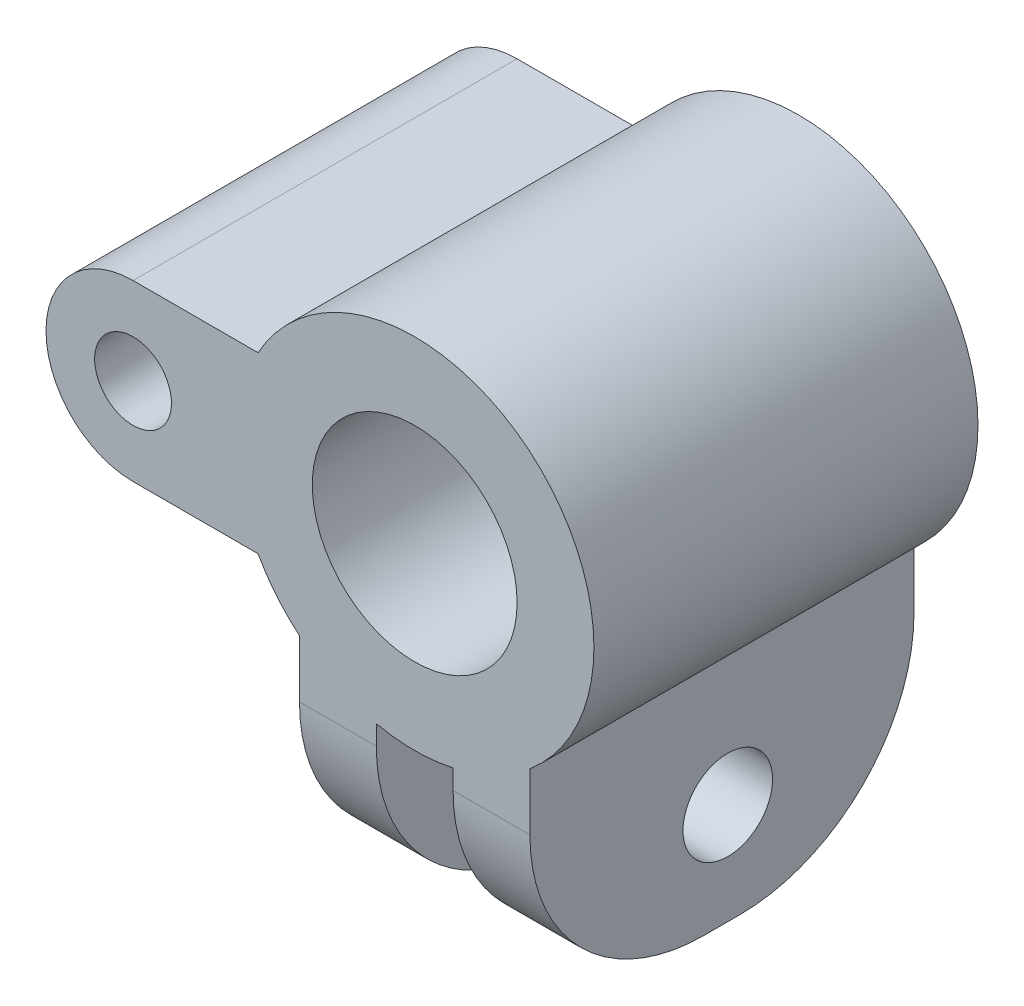
ISO-10303-21;
HEADER;
FILE_DESCRIPTION(('STEP AP214'),'2;1');
FILE_NAME('part.step','',(''),(''),'','','');
FILE_SCHEMA(('AUTOMOTIVE_DESIGN { 1 0 10303 214 1 1 1 1 }'));
ENDSEC;
DATA;
#1=APPLICATION_CONTEXT('core data for automotive mechanical design processes');
#2=APPLICATION_PROTOCOL_DEFINITION('international standard','automotive_design',2000,#1);
#3=PRODUCT_CONTEXT('',#1,'mechanical');
#4=PRODUCT('Part','Part','',(#3));
#5=PRODUCT_RELATED_PRODUCT_CATEGORY('part','',(#4));
#6=PRODUCT_DEFINITION_FORMATION('','',#4);
#7=PRODUCT_DEFINITION_CONTEXT('part definition',#1,'design');
#8=PRODUCT_DEFINITION('design','',#6,#7);
#9=PRODUCT_DEFINITION_SHAPE('','',#8);
#10=(LENGTH_UNIT() NAMED_UNIT(*) SI_UNIT(.MILLI.,.METRE.));
#11=(NAMED_UNIT(*) PLANE_ANGLE_UNIT() SI_UNIT($,.RADIAN.));
#12=(NAMED_UNIT(*) SI_UNIT($,.STERADIAN.) SOLID_ANGLE_UNIT());
#13=UNCERTAINTY_MEASURE_WITH_UNIT(LENGTH_MEASURE(1.E-05),#10,'distance_accuracy_value','');
#14=(GEOMETRIC_REPRESENTATION_CONTEXT(3) GLOBAL_UNCERTAINTY_ASSIGNED_CONTEXT((#13)) GLOBAL_UNIT_ASSIGNED_CONTEXT((#10,
#11,#12)) REPRESENTATION_CONTEXT('',''));
#15=CARTESIAN_POINT('',(0.,0.,0.));
#16=DIRECTION('',(0.,0.,1.));
#17=DIRECTION('',(1.,0.,0.));
#18=AXIS2_PLACEMENT_3D('',#15,#16,#17);
#19=CARTESIAN_POINT('',(0.,0.,75.));
#20=DIRECTION('',(0.,0.,-1.));
#21=DIRECTION('',(-1.,0.,0.));
#22=AXIS2_PLACEMENT_3D('',#19,#20,#21);
#23=CYLINDRICAL_SURFACE('',#22,35.);
#24=DIRECTION('',(0.,0.,-1.));
#25=VECTOR('',#24,1.);
#26=CARTESIAN_POINT('',(-22.5,-26.809513236909,75.));
#27=LINE('',#26,#25);
#28=CARTESIAN_POINT('',(-22.5,-26.809513236909,75.));
#29=VERTEX_POINT('',#28);
#30=CARTESIAN_POINT('',(-22.5,-26.809513236909,0.));
#31=VERTEX_POINT('',#30);
#32=EDGE_CURVE('E189',#29,#31,#27,.T.);
#33=ORIENTED_EDGE('',*,*,#32,.F.);
#34=CARTESIAN_POINT('',(0.,0.,75.));
#35=DIRECTION('',(0.,0.,1.));
#36=DIRECTION('',(1.,0.,0.));
#37=AXIS2_PLACEMENT_3D('',#34,#35,#36);
#38=CIRCLE('',#37,35.);
#39=CARTESIAN_POINT('',(-30.5941170815567,-17.,75.));
#40=VERTEX_POINT('',#39);
#41=EDGE_CURVE('E214',#40,#29,#38,.T.);
#42=ORIENTED_EDGE('',*,*,#41,.F.);
#43=DIRECTION('',(0.,0.,-1.));
#44=VECTOR('',#43,1.);
#45=CARTESIAN_POINT('',(-30.5941170815567,-17.,75.));
#46=LINE('',#45,#44);
#47=CARTESIAN_POINT('',(-30.5941170815567,-17.,0.));
#48=VERTEX_POINT('',#47);
#49=EDGE_CURVE('E227',#40,#48,#46,.T.);
#50=ORIENTED_EDGE('',*,*,#49,.T.);
#51=CARTESIAN_POINT('',(0.,0.,0.));
#52=DIRECTION('',(0.,0.,1.));
#53=DIRECTION('',(1.,0.,0.));
#54=AXIS2_PLACEMENT_3D('',#51,#52,#53);
#55=CIRCLE('',#54,35.);
#56=EDGE_CURVE('E172',#48,#31,#55,.T.);
#57=ORIENTED_EDGE('',*,*,#56,.T.);
#58=EDGE_LOOP('',(#33,#42,#50,#57));
#59=FACE_BOUND('',#58,.T.);
#60=ADVANCED_FACE('F33',(#59),#23,.T.);
#61=DIRECTION('',(0.,0.,-1.));
#62=VECTOR('',#61,1.);
#63=CARTESIAN_POINT('',(-7.49999999999999,-34.1869858279434,75.));
#64=LINE('',#63,#62);
#65=CARTESIAN_POINT('',(-7.49999999999999,-34.1869858279434,75.));
#66=VERTEX_POINT('',#65);
#67=CARTESIAN_POINT('',(-7.49999999999999,-34.1869858279434,0.));
#68=VERTEX_POINT('',#67);
#69=EDGE_CURVE('E154',#66,#68,#64,.T.);
#70=ORIENTED_EDGE('',*,*,#69,.T.);
#71=CARTESIAN_POINT('',(7.50000000000001,-34.1869858279434,0.));
#72=VERTEX_POINT('',#71);
#73=EDGE_CURVE('E162',#68,#72,#55,.T.);
#74=ORIENTED_EDGE('',*,*,#73,.T.);
#75=DIRECTION('',(0.,0.,-1.));
#76=VECTOR('',#75,1.);
#77=CARTESIAN_POINT('',(7.50000000000001,-34.1869858279434,75.));
#78=LINE('',#77,#76);
#79=CARTESIAN_POINT('',(7.50000000000001,-34.1869858279434,75.));
#80=VERTEX_POINT('',#79);
#81=EDGE_CURVE('E206',#80,#72,#78,.T.);
#82=ORIENTED_EDGE('',*,*,#81,.F.);
#83=EDGE_CURVE('E178',#66,#80,#38,.T.);
#84=ORIENTED_EDGE('',*,*,#83,.F.);
#85=EDGE_LOOP('',(#70,#74,#82,#84));
#86=FACE_BOUND('',#85,.T.);
#87=ADVANCED_FACE('F176',(#86),#23,.T.);
#88=CARTESIAN_POINT('',(22.5,-26.809513236909,75.));
#89=VERTEX_POINT('',#88);
#90=CARTESIAN_POINT('',(-30.5941170815567,17.,75.));
#91=VERTEX_POINT('',#90);
#92=EDGE_CURVE('E212',#89,#91,#38,.T.);
#93=ORIENTED_EDGE('',*,*,#92,.F.);
#94=DIRECTION('',(0.,0.,-1.));
#95=VECTOR('',#94,1.);
#96=CARTESIAN_POINT('',(22.5,-26.809513236909,75.));
#97=LINE('',#96,#95);
#98=CARTESIAN_POINT('',(22.5,-26.809513236909,0.));
#99=VERTEX_POINT('',#98);
#100=EDGE_CURVE('E197',#89,#99,#97,.T.);
#101=ORIENTED_EDGE('',*,*,#100,.T.);
#102=CARTESIAN_POINT('',(-30.5941170815567,17.,0.));
#103=VERTEX_POINT('',#102);
#104=EDGE_CURVE('E173',#99,#103,#55,.T.);
#105=ORIENTED_EDGE('',*,*,#104,.T.);
#106=DIRECTION('',(0.,0.,-1.));
#107=VECTOR('',#106,1.);
#108=CARTESIAN_POINT('',(-30.5941170815567,17.,75.));
#109=LINE('',#108,#107);
#110=EDGE_CURVE('E246',#91,#103,#109,.T.);
#111=ORIENTED_EDGE('',*,*,#110,.F.);
#112=EDGE_LOOP('',(#93,#101,#105,#111));
#113=FACE_BOUND('',#112,.T.);
#114=ADVANCED_FACE('F297',(#113),#23,.T.);
#115=CARTESIAN_POINT('',(0.,17.,75.));
#116=DIRECTION('',(0.,1.,0.));
#117=DIRECTION('',(0.,0.,1.));
#118=AXIS2_PLACEMENT_3D('',#115,#116,#117);
#119=PLANE('',#118);
#120=DIRECTION('',(1.,0.,0.));
#121=VECTOR('',#120,1.);
#122=CARTESIAN_POINT('',(0.,17.,0.));
#123=LINE('',#122,#121);
#124=CARTESIAN_POINT('',(-55.,17.,0.));
#125=VERTEX_POINT('',#124);
#126=EDGE_CURVE('E230',#125,#103,#123,.T.);
#127=ORIENTED_EDGE('',*,*,#126,.F.);
#128=DIRECTION('',(0.,0.,-1.));
#129=VECTOR('',#128,1.);
#130=CARTESIAN_POINT('',(-55.,17.,75.));
#131=LINE('',#130,#129);
#132=CARTESIAN_POINT('',(-55.,17.,75.));
#133=VERTEX_POINT('',#132);
#134=EDGE_CURVE('E244',#133,#125,#131,.T.);
#135=ORIENTED_EDGE('',*,*,#134,.F.);
#136=DIRECTION('',(1.,0.,0.));
#137=VECTOR('',#136,1.);
#138=CARTESIAN_POINT('',(0.,17.,75.));
#139=LINE('',#138,#137);
#140=EDGE_CURVE('E217',#133,#91,#139,.T.);
#141=ORIENTED_EDGE('',*,*,#140,.T.);
#142=ORIENTED_EDGE('',*,*,#110,.T.);
#143=EDGE_LOOP('',(#127,#135,#141,#142));
#144=FACE_BOUND('',#143,.T.);
#145=ADVANCED_FACE('F300',(#144),#119,.T.);
#146=CARTESIAN_POINT('',(-55.,0.,75.));
#147=DIRECTION('',(0.,0.,-1.));
#148=DIRECTION('',(-1.,0.,0.));
#149=AXIS2_PLACEMENT_3D('',#146,#147,#148);
#150=CYLINDRICAL_SURFACE('',#149,17.);
#151=CARTESIAN_POINT('',(-55.,0.,0.));
#152=DIRECTION('',(0.,0.,1.));
#153=DIRECTION('',(1.,0.,0.));
#154=AXIS2_PLACEMENT_3D('',#151,#152,#153);
#155=CIRCLE('',#154,17.);
#156=CARTESIAN_POINT('',(-55.,-17.,0.));
#157=VERTEX_POINT('',#156);
#158=EDGE_CURVE('E233',#125,#157,#155,.T.);
#159=ORIENTED_EDGE('',*,*,#158,.T.);
#160=DIRECTION('',(0.,0.,-1.));
#161=VECTOR('',#160,1.);
#162=CARTESIAN_POINT('',(-55.,-17.,75.));
#163=LINE('',#162,#161);
#164=CARTESIAN_POINT('',(-55.,-17.,75.));
#165=VERTEX_POINT('',#164);
#166=EDGE_CURVE('E241',#165,#157,#163,.T.);
#167=ORIENTED_EDGE('',*,*,#166,.F.);
#168=CARTESIAN_POINT('',(-55.,0.,75.));
#169=DIRECTION('',(0.,0.,1.));
#170=DIRECTION('',(1.,0.,0.));
#171=AXIS2_PLACEMENT_3D('',#168,#169,#170);
#172=CIRCLE('',#171,17.);
#173=EDGE_CURVE('E220',#133,#165,#172,.T.);
#174=ORIENTED_EDGE('',*,*,#173,.F.);
#175=ORIENTED_EDGE('',*,*,#134,.T.);
#176=EDGE_LOOP('',(#159,#167,#174,#175));
#177=FACE_BOUND('',#176,.T.);
#178=ADVANCED_FACE('F305',(#177),#150,.T.);
#179=CARTESIAN_POINT('',(0.,-17.,75.));
#180=DIRECTION('',(0.,1.,0.));
#181=DIRECTION('',(0.,0.,1.));
#182=AXIS2_PLACEMENT_3D('',#179,#180,#181);
#183=PLANE('',#182);
#184=DIRECTION('',(1.,0.,0.));
#185=VECTOR('',#184,1.);
#186=CARTESIAN_POINT('',(0.,-17.,0.));
#187=LINE('',#186,#185);
#188=EDGE_CURVE('E235',#157,#48,#187,.T.);
#189=ORIENTED_EDGE('',*,*,#188,.T.);
#190=ORIENTED_EDGE('',*,*,#49,.F.);
#191=DIRECTION('',(1.,0.,0.));
#192=VECTOR('',#191,1.);
#193=CARTESIAN_POINT('',(0.,-17.,75.));
#194=LINE('',#193,#192);
#195=EDGE_CURVE('E222',#165,#40,#194,.T.);
#196=ORIENTED_EDGE('',*,*,#195,.F.);
#197=ORIENTED_EDGE('',*,*,#166,.T.);
#198=EDGE_LOOP('',(#189,#190,#196,#197));
#199=FACE_BOUND('',#198,.T.);
#200=ADVANCED_FACE('F312',(#199),#183,.F.);
#201=CARTESIAN_POINT('',(-55.,0.,75.));
#202=DIRECTION('',(0.,0.,-1.));
#203=DIRECTION('',(-1.,0.,0.));
#204=AXIS2_PLACEMENT_3D('',#201,#202,#203);
#205=CYLINDRICAL_SURFACE('',#204,7.5);
#206=CARTESIAN_POINT('',(-55.,0.,75.));
#207=DIRECTION('',(0.,0.,1.));
#208=DIRECTION('',(1.,0.,0.));
#209=AXIS2_PLACEMENT_3D('',#206,#207,#208);
#210=CIRCLE('',#209,7.5);
#211=CARTESIAN_POINT('',(-47.5,0.,75.));
#212=VERTEX_POINT('',#211);
#213=EDGE_CURVE('E209',#212,#212,#210,.T.);
#214=ORIENTED_EDGE('',*,*,#213,.T.);
#215=EDGE_LOOP('',(#214));
#216=FACE_BOUND('',#215,.T.);
#217=CARTESIAN_POINT('',(-55.,0.,0.));
#218=DIRECTION('',(0.,0.,1.));
#219=DIRECTION('',(1.,0.,0.));
#220=AXIS2_PLACEMENT_3D('',#217,#218,#219);
#221=CIRCLE('',#220,7.5);
#222=CARTESIAN_POINT('',(-47.5,0.,0.));
#223=VERTEX_POINT('',#222);
#224=EDGE_CURVE('E208',#223,#223,#221,.T.);
#225=ORIENTED_EDGE('',*,*,#224,.F.);
#226=EDGE_LOOP('',(#225));
#227=FACE_BOUND('',#226,.T.);
#228=ADVANCED_FACE('F371',(#216,#227),#205,.F.);
#229=CARTESIAN_POINT('',(0.,0.,75.));
#230=DIRECTION('',(0.,0.,-1.));
#231=DIRECTION('',(-1.,0.,0.));
#232=AXIS2_PLACEMENT_3D('',#229,#230,#231);
#233=CYLINDRICAL_SURFACE('',#232,20.);
#234=CARTESIAN_POINT('',(0.,0.,75.));
#235=DIRECTION('',(0.,0.,1.));
#236=DIRECTION('',(1.,0.,0.));
#237=AXIS2_PLACEMENT_3D('',#234,#235,#236);
#238=CIRCLE('',#237,20.);
#239=CARTESIAN_POINT('',(20.,0.,75.));
#240=VERTEX_POINT('',#239);
#241=EDGE_CURVE('E224',#240,#240,#238,.T.);
#242=ORIENTED_EDGE('',*,*,#241,.T.);
#243=EDGE_LOOP('',(#242));
#244=FACE_BOUND('',#243,.T.);
#245=CARTESIAN_POINT('',(0.,0.,0.));
#246=DIRECTION('',(0.,0.,1.));
#247=DIRECTION('',(1.,0.,0.));
#248=AXIS2_PLACEMENT_3D('',#245,#246,#247);
#249=CIRCLE('',#248,20.);
#250=CARTESIAN_POINT('',(20.,0.,0.));
#251=VERTEX_POINT('',#250);
#252=EDGE_CURVE('E213',#251,#251,#249,.T.);
#253=ORIENTED_EDGE('',*,*,#252,.F.);
#254=EDGE_LOOP('',(#253));
#255=FACE_BOUND('',#254,.T.);
#256=ADVANCED_FACE('F372',(#244,#255),#233,.F.);
#257=CARTESIAN_POINT('',(0.,0.,75.));
#258=DIRECTION('',(0.,0.,1.));
#259=DIRECTION('',(1.,0.,0.));
#260=AXIS2_PLACEMENT_3D('',#257,#258,#259);
#261=PLANE('',#260);
#262=ORIENTED_EDGE('',*,*,#213,.F.);
#263=EDGE_LOOP('',(#262));
#264=FACE_BOUND('',#263,.T.);
#265=DIRECTION('',(0.,1.,0.));
#266=VECTOR('',#265,1.);
#267=CARTESIAN_POINT('',(7.50000000000001,0.,75.));
#268=LINE('',#267,#266);
#269=CARTESIAN_POINT('',(7.50000000000001,-38.,75.));
#270=VERTEX_POINT('',#269);
#271=EDGE_CURVE('E192',#270,#80,#268,.T.);
#272=ORIENTED_EDGE('',*,*,#271,.F.);
#273=DIRECTION('',(-1.,0.,0.));
#274=VECTOR('',#273,1.);
#275=CARTESIAN_POINT('',(0.,-38.,75.));
#276=LINE('',#275,#274);
#277=CARTESIAN_POINT('',(22.5,-38.,75.));
#278=VERTEX_POINT('',#277);
#279=EDGE_CURVE('E11',#270,#278,#276,.F.);
#280=ORIENTED_EDGE('',*,*,#279,.T.);
#281=DIRECTION('',(0.,-1.,0.));
#282=VECTOR('',#281,1.);
#283=CARTESIAN_POINT('',(22.5,0.,75.));
#284=LINE('',#283,#282);
#285=EDGE_CURVE('E194',#89,#278,#284,.T.);
#286=ORIENTED_EDGE('',*,*,#285,.F.);
#287=ORIENTED_EDGE('',*,*,#92,.T.);
#288=ORIENTED_EDGE('',*,*,#140,.F.);
#289=ORIENTED_EDGE('',*,*,#173,.T.);
#290=ORIENTED_EDGE('',*,*,#195,.T.);
#291=ORIENTED_EDGE('',*,*,#41,.T.);
#292=DIRECTION('',(0.,-1.,0.));
#293=VECTOR('',#292,1.);
#294=CARTESIAN_POINT('',(-22.5,0.,75.));
#295=LINE('',#294,#293);
#296=CARTESIAN_POINT('',(-22.5,-38.,75.));
#297=VERTEX_POINT('',#296);
#298=EDGE_CURVE('E158',#29,#297,#295,.T.);
#299=ORIENTED_EDGE('',*,*,#298,.T.);
#300=DIRECTION('',(1.,0.,0.));
#301=VECTOR('',#300,1.);
#302=CARTESIAN_POINT('',(-7.50000000000002,-38.,75.));
#303=LINE('',#302,#301);
#304=CARTESIAN_POINT('',(-7.49999999999999,-38.,75.));
#305=VERTEX_POINT('',#304);
#306=EDGE_CURVE('E263',#297,#305,#303,.T.);
#307=ORIENTED_EDGE('',*,*,#306,.T.);
#308=DIRECTION('',(0.,1.,0.));
#309=VECTOR('',#308,1.);
#310=CARTESIAN_POINT('',(-7.49999999999999,0.,75.));
#311=LINE('',#310,#309);
#312=EDGE_CURVE('E180',#305,#66,#311,.T.);
#313=ORIENTED_EDGE('',*,*,#312,.T.);
#314=ORIENTED_EDGE('',*,*,#83,.T.);
#315=EDGE_LOOP('',(#272,#280,#286,#287,#288,#289,#290,#291,#299,#307,#313,#314));
#316=FACE_BOUND('',#315,.T.);
#317=ORIENTED_EDGE('',*,*,#241,.F.);
#318=EDGE_LOOP('',(#317));
#319=FACE_BOUND('',#318,.T.);
#320=ADVANCED_FACE('F292',(#264,#316,#319),#261,.T.);
#321=CARTESIAN_POINT('',(0.,0.,0.));
#322=DIRECTION('',(0.,0.,1.));
#323=DIRECTION('',(1.,0.,0.));
#324=AXIS2_PLACEMENT_3D('',#321,#322,#323);
#325=PLANE('',#324);
#326=ORIENTED_EDGE('',*,*,#224,.T.);
#327=EDGE_LOOP('',(#326));
#328=FACE_BOUND('',#327,.T.);
#329=DIRECTION('',(0.,-1.,0.));
#330=VECTOR('',#329,1.);
#331=CARTESIAN_POINT('',(22.5,0.,0.));
#332=LINE('',#331,#330);
#333=CARTESIAN_POINT('',(22.5,-38.,0.));
#334=VERTEX_POINT('',#333);
#335=EDGE_CURVE('E195',#99,#334,#332,.T.);
#336=ORIENTED_EDGE('',*,*,#335,.T.);
#337=DIRECTION('',(-1.,0.,0.));
#338=VECTOR('',#337,1.);
#339=CARTESIAN_POINT('',(7.50000000000004,-38.,0.));
#340=LINE('',#339,#338);
#341=CARTESIAN_POINT('',(7.50000000000001,-38.,0.));
#342=VERTEX_POINT('',#341);
#343=EDGE_CURVE('E266',#334,#342,#340,.T.);
#344=ORIENTED_EDGE('',*,*,#343,.T.);
#345=DIRECTION('',(0.,1.,0.));
#346=VECTOR('',#345,1.);
#347=CARTESIAN_POINT('',(7.50000000000001,0.,0.));
#348=LINE('',#347,#346);
#349=EDGE_CURVE('E168',#342,#72,#348,.T.);
#350=ORIENTED_EDGE('',*,*,#349,.T.);
#351=ORIENTED_EDGE('',*,*,#73,.F.);
#352=DIRECTION('',(0.,1.,0.));
#353=VECTOR('',#352,1.);
#354=CARTESIAN_POINT('',(-7.49999999999999,0.,0.));
#355=LINE('',#354,#353);
#356=CARTESIAN_POINT('',(-7.49999999999999,-38.,0.));
#357=VERTEX_POINT('',#356);
#358=EDGE_CURVE('E148',#357,#68,#355,.T.);
#359=ORIENTED_EDGE('',*,*,#358,.F.);
#360=DIRECTION('',(1.,0.,0.));
#361=VECTOR('',#360,1.);
#362=CARTESIAN_POINT('',(0.,-38.,0.));
#363=LINE('',#362,#361);
#364=CARTESIAN_POINT('',(-22.5,-38.,0.));
#365=VERTEX_POINT('',#364);
#366=EDGE_CURVE('E257',#357,#365,#363,.F.);
#367=ORIENTED_EDGE('',*,*,#366,.T.);
#368=DIRECTION('',(0.,-1.,0.));
#369=VECTOR('',#368,1.);
#370=CARTESIAN_POINT('',(-22.5,0.,0.));
#371=LINE('',#370,#369);
#372=EDGE_CURVE('E159',#31,#365,#371,.T.);
#373=ORIENTED_EDGE('',*,*,#372,.F.);
#374=ORIENTED_EDGE('',*,*,#56,.F.);
#375=ORIENTED_EDGE('',*,*,#188,.F.);
#376=ORIENTED_EDGE('',*,*,#158,.F.);
#377=ORIENTED_EDGE('',*,*,#126,.T.);
#378=ORIENTED_EDGE('',*,*,#104,.F.);
#379=EDGE_LOOP('',(#336,#344,#350,#351,#359,#367,#373,#374,#375,#376,#377,#378));
#380=FACE_BOUND('',#379,.T.);
#381=ORIENTED_EDGE('',*,*,#252,.T.);
#382=EDGE_LOOP('',(#381));
#383=FACE_BOUND('',#382,.T.);
#384=ADVANCED_FACE('F164',(#328,#380,#383),#325,.F.);
#385=CARTESIAN_POINT('',(7.50000000000001,0.,75.));
#386=DIRECTION('',(-1.,0.,0.));
#387=DIRECTION('',(0.,0.,1.));
#388=AXIS2_PLACEMENT_3D('',#385,#386,#387);
#389=PLANE('',#388);
#390=CARTESIAN_POINT('',(7.5,-52.2463503567607,36.3630772137284));
#391=DIRECTION('',(1.,0.,0.));
#392=DIRECTION('',(0.,1.,0.));
#393=AXIS2_PLACEMENT_3D('',#390,#391,#392);
#394=CIRCLE('',#393,8.75025667169042);
#395=CARTESIAN_POINT('',(7.5,-43.4960936850703,36.3630772137284));
#396=VERTEX_POINT('',#395);
#397=EDGE_CURVE('E321',#396,#396,#394,.T.);
#398=ORIENTED_EDGE('',*,*,#397,.T.);
#399=EDGE_LOOP('',(#398));
#400=FACE_BOUND('',#399,.T.);
#401=ORIENTED_EDGE('',*,*,#349,.F.);
#402=CARTESIAN_POINT('',(7.50000000000001,-38.,34.));
#403=DIRECTION('',(-1.,0.,0.));
#404=DIRECTION('',(0.,0.,1.));
#405=AXIS2_PLACEMENT_3D('',#402,#403,#404);
#406=CIRCLE('',#405,34.);
#407=CARTESIAN_POINT('',(7.50000000000001,-72.,34.));
#408=VERTEX_POINT('',#407);
#409=EDGE_CURVE('E270',#342,#408,#406,.T.);
#410=ORIENTED_EDGE('',*,*,#409,.T.);
#411=DIRECTION('',(0.,0.,-1.));
#412=VECTOR('',#411,1.);
#413=CARTESIAN_POINT('',(7.50000000000001,-72.,75.));
#414=LINE('',#413,#412);
#415=CARTESIAN_POINT('',(7.50000000000001,-72.,41.));
#416=VERTEX_POINT('',#415);
#417=EDGE_CURVE('E204',#416,#408,#414,.T.);
#418=ORIENTED_EDGE('',*,*,#417,.F.);
#419=CARTESIAN_POINT('',(7.50000000000001,-38.,41.));
#420=DIRECTION('',(-1.,0.,0.));
#421=DIRECTION('',(0.,0.,1.));
#422=AXIS2_PLACEMENT_3D('',#419,#420,#421);
#423=CIRCLE('',#422,34.);
#424=EDGE_CURVE('E268',#416,#270,#423,.T.);
#425=ORIENTED_EDGE('',*,*,#424,.T.);
#426=ORIENTED_EDGE('',*,*,#271,.T.);
#427=ORIENTED_EDGE('',*,*,#81,.T.);
#428=EDGE_LOOP('',(#401,#410,#418,#425,#426,#427));
#429=FACE_BOUND('',#428,.T.);
#430=ADVANCED_FACE('F287',(#400,#429),#389,.T.);
#431=CARTESIAN_POINT('',(0.,-72.,75.));
#432=DIRECTION('',(0.,-1.,0.));
#433=DIRECTION('',(1.,0.,0.));
#434=AXIS2_PLACEMENT_3D('',#431,#432,#433);
#435=PLANE('',#434);
#436=ORIENTED_EDGE('',*,*,#417,.T.);
#437=DIRECTION('',(-1.,0.,0.));
#438=VECTOR('',#437,1.);
#439=CARTESIAN_POINT('',(22.5,-72.,34.));
#440=LINE('',#439,#438);
#441=CARTESIAN_POINT('',(22.5,-72.,34.));
#442=VERTEX_POINT('',#441);
#443=EDGE_CURVE('E54',#408,#442,#440,.F.);
#444=ORIENTED_EDGE('',*,*,#443,.T.);
#445=DIRECTION('',(0.,0.,-1.));
#446=VECTOR('',#445,1.);
#447=CARTESIAN_POINT('',(22.5,-72.,75.));
#448=LINE('',#447,#446);
#449=CARTESIAN_POINT('',(22.5,-72.,41.));
#450=VERTEX_POINT('',#449);
#451=EDGE_CURVE('E202',#450,#442,#448,.T.);
#452=ORIENTED_EDGE('',*,*,#451,.F.);
#453=DIRECTION('',(-1.,0.,0.));
#454=VECTOR('',#453,1.);
#455=CARTESIAN_POINT('',(0.,-72.,41.));
#456=LINE('',#455,#454);
#457=EDGE_CURVE('E272',#450,#416,#456,.T.);
#458=ORIENTED_EDGE('',*,*,#457,.T.);
#459=EDGE_LOOP('',(#436,#444,#452,#458));
#460=FACE_BOUND('',#459,.T.);
#461=ADVANCED_FACE('F288',(#460),#435,.T.);
#462=CARTESIAN_POINT('',(22.5,0.,75.));
#463=DIRECTION('',(1.,0.,0.));
#464=DIRECTION('',(0.,1.,0.));
#465=AXIS2_PLACEMENT_3D('',#462,#463,#464);
#466=PLANE('',#465);
#467=CARTESIAN_POINT('',(22.5,-52.2463503567607,36.3630772137284));
#468=DIRECTION('',(1.,0.,0.));
#469=DIRECTION('',(0.,1.,0.));
#470=AXIS2_PLACEMENT_3D('',#467,#468,#469);
#471=CIRCLE('',#470,8.75025667169042);
#472=CARTESIAN_POINT('',(22.5,-43.4960936850703,36.3630772137284));
#473=VERTEX_POINT('',#472);
#474=EDGE_CURVE('E323',#473,#473,#471,.T.);
#475=ORIENTED_EDGE('',*,*,#474,.F.);
#476=EDGE_LOOP('',(#475));
#477=FACE_BOUND('',#476,.T.);
#478=ORIENTED_EDGE('',*,*,#451,.T.);
#479=CARTESIAN_POINT('',(22.5,-38.,34.));
#480=DIRECTION('',(1.,0.,0.));
#481=DIRECTION('',(0.,1.,0.));
#482=AXIS2_PLACEMENT_3D('',#479,#480,#481);
#483=CIRCLE('',#482,34.);
#484=EDGE_CURVE('E41',#442,#334,#483,.T.);
#485=ORIENTED_EDGE('',*,*,#484,.T.);
#486=ORIENTED_EDGE('',*,*,#335,.F.);
#487=ORIENTED_EDGE('',*,*,#100,.F.);
#488=ORIENTED_EDGE('',*,*,#285,.T.);
#489=CARTESIAN_POINT('',(22.5,-38.,41.));
#490=DIRECTION('',(1.,0.,0.));
#491=DIRECTION('',(0.,1.,0.));
#492=AXIS2_PLACEMENT_3D('',#489,#490,#491);
#493=CIRCLE('',#492,34.);
#494=EDGE_CURVE('E276',#278,#450,#493,.T.);
#495=ORIENTED_EDGE('',*,*,#494,.T.);
#496=EDGE_LOOP('',(#478,#485,#486,#487,#488,#495));
#497=FACE_BOUND('',#496,.T.);
#498=ADVANCED_FACE('F280',(#477,#497),#466,.T.);
#499=CARTESIAN_POINT('',(-22.5,0.,75.));
#500=DIRECTION('',(1.,0.,0.));
#501=DIRECTION('',(0.,1.,0.));
#502=AXIS2_PLACEMENT_3D('',#499,#500,#501);
#503=PLANE('',#502);
#504=CARTESIAN_POINT('',(-22.5,-52.2463503567607,36.3630772137284));
#505=DIRECTION('',(1.,0.,0.));
#506=DIRECTION('',(0.,1.,0.));
#507=AXIS2_PLACEMENT_3D('',#504,#505,#506);
#508=CIRCLE('',#507,8.75025667169042);
#509=CARTESIAN_POINT('',(-22.5,-43.4960936850703,36.3630772137284));
#510=VERTEX_POINT('',#509);
#511=EDGE_CURVE('E330',#510,#510,#508,.T.);
#512=ORIENTED_EDGE('',*,*,#511,.T.);
#513=EDGE_LOOP('',(#512));
#514=FACE_BOUND('',#513,.T.);
#515=ORIENTED_EDGE('',*,*,#372,.T.);
#516=CARTESIAN_POINT('',(-22.5,-38.,34.));
#517=DIRECTION('',(1.,0.,0.));
#518=DIRECTION('',(0.,1.,0.));
#519=AXIS2_PLACEMENT_3D('',#516,#517,#518);
#520=CIRCLE('',#519,34.);
#521=CARTESIAN_POINT('',(-22.5,-72.,34.));
#522=VERTEX_POINT('',#521);
#523=EDGE_CURVE('E261',#365,#522,#520,.F.);
#524=ORIENTED_EDGE('',*,*,#523,.T.);
#525=DIRECTION('',(0.,0.,-1.));
#526=VECTOR('',#525,1.);
#527=CARTESIAN_POINT('',(-22.5,-72.,75.));
#528=LINE('',#527,#526);
#529=CARTESIAN_POINT('',(-22.5,-72.,41.));
#530=VERTEX_POINT('',#529);
#531=EDGE_CURVE('E182',#530,#522,#528,.T.);
#532=ORIENTED_EDGE('',*,*,#531,.F.);
#533=CARTESIAN_POINT('',(-22.5,-38.,41.));
#534=DIRECTION('',(1.,0.,0.));
#535=DIRECTION('',(0.,1.,0.));
#536=AXIS2_PLACEMENT_3D('',#533,#534,#535);
#537=CIRCLE('',#536,34.);
#538=EDGE_CURVE('E259',#530,#297,#537,.F.);
#539=ORIENTED_EDGE('',*,*,#538,.T.);
#540=ORIENTED_EDGE('',*,*,#298,.F.);
#541=ORIENTED_EDGE('',*,*,#32,.T.);
#542=EDGE_LOOP('',(#515,#524,#532,#539,#540,#541));
#543=FACE_BOUND('',#542,.T.);
#544=ADVANCED_FACE('F319',(#514,#543),#503,.F.);
#545=CARTESIAN_POINT('',(0.,-72.,75.));
#546=DIRECTION('',(0.,1.,0.));
#547=DIRECTION('',(-1.,0.,0.));
#548=AXIS2_PLACEMENT_3D('',#545,#546,#547);
#549=PLANE('',#548);
#550=ORIENTED_EDGE('',*,*,#531,.T.);
#551=DIRECTION('',(1.,0.,0.));
#552=VECTOR('',#551,1.);
#553=CARTESIAN_POINT('',(0.,-72.,34.));
#554=LINE('',#553,#552);
#555=CARTESIAN_POINT('',(-7.49999999999999,-72.,34.));
#556=VERTEX_POINT('',#555);
#557=EDGE_CURVE('E251',#522,#556,#554,.T.);
#558=ORIENTED_EDGE('',*,*,#557,.T.);
#559=DIRECTION('',(0.,0.,-1.));
#560=VECTOR('',#559,1.);
#561=CARTESIAN_POINT('',(-7.49999999999999,-72.,75.));
#562=LINE('',#561,#560);
#563=CARTESIAN_POINT('',(-7.49999999999999,-72.,41.));
#564=VERTEX_POINT('',#563);
#565=EDGE_CURVE('E179',#564,#556,#562,.T.);
#566=ORIENTED_EDGE('',*,*,#565,.F.);
#567=DIRECTION('',(1.,0.,0.));
#568=VECTOR('',#567,1.);
#569=CARTESIAN_POINT('',(-22.5,-72.,41.));
#570=LINE('',#569,#568);
#571=EDGE_CURVE('E249',#564,#530,#570,.F.);
#572=ORIENTED_EDGE('',*,*,#571,.T.);
#573=EDGE_LOOP('',(#550,#558,#566,#572));
#574=FACE_BOUND('',#573,.T.);
#575=ADVANCED_FACE('F341',(#574),#549,.F.);
#576=CARTESIAN_POINT('',(-7.49999999999999,0.,75.));
#577=DIRECTION('',(-1.,0.,0.));
#578=DIRECTION('',(0.,0.,1.));
#579=AXIS2_PLACEMENT_3D('',#576,#577,#578);
#580=PLANE('',#579);
#581=CARTESIAN_POINT('',(-7.5,-52.2463503567607,36.3630772137284));
#582=DIRECTION('',(1.,0.,0.));
#583=DIRECTION('',(0.,1.,0.));
#584=AXIS2_PLACEMENT_3D('',#581,#582,#583);
#585=CIRCLE('',#584,8.75025667169042);
#586=CARTESIAN_POINT('',(-7.5,-43.4960936850703,36.3630772137284));
#587=VERTEX_POINT('',#586);
#588=EDGE_CURVE('E328',#587,#587,#585,.T.);
#589=ORIENTED_EDGE('',*,*,#588,.F.);
#590=EDGE_LOOP('',(#589));
#591=FACE_BOUND('',#590,.T.);
#592=ORIENTED_EDGE('',*,*,#565,.T.);
#593=CARTESIAN_POINT('',(-7.49999999999999,-38.,34.));
#594=DIRECTION('',(-1.,0.,0.));
#595=DIRECTION('',(0.,0.,1.));
#596=AXIS2_PLACEMENT_3D('',#593,#594,#595);
#597=CIRCLE('',#596,34.);
#598=EDGE_CURVE('E155',#556,#357,#597,.F.);
#599=ORIENTED_EDGE('',*,*,#598,.T.);
#600=ORIENTED_EDGE('',*,*,#358,.T.);
#601=ORIENTED_EDGE('',*,*,#69,.F.);
#602=ORIENTED_EDGE('',*,*,#312,.F.);
#603=CARTESIAN_POINT('',(-7.49999999999999,-38.,41.));
#604=DIRECTION('',(-1.,0.,0.));
#605=DIRECTION('',(0.,0.,1.));
#606=AXIS2_PLACEMENT_3D('',#603,#604,#605);
#607=CIRCLE('',#606,34.);
#608=EDGE_CURVE('E254',#305,#564,#607,.F.);
#609=ORIENTED_EDGE('',*,*,#608,.T.);
#610=EDGE_LOOP('',(#592,#599,#600,#601,#602,#609));
#611=FACE_BOUND('',#610,.T.);
#612=ADVANCED_FACE('F151',(#591,#611),#580,.F.);
#613=CARTESIAN_POINT('',(0.,-38.,34.));
#614=DIRECTION('',(1.,0.,0.));
#615=DIRECTION('',(0.,1.,0.));
#616=AXIS2_PLACEMENT_3D('',#613,#614,#615);
#617=CYLINDRICAL_SURFACE('',#616,34.);
#618=ORIENTED_EDGE('',*,*,#523,.F.);
#619=ORIENTED_EDGE('',*,*,#366,.F.);
#620=ORIENTED_EDGE('',*,*,#598,.F.);
#621=ORIENTED_EDGE('',*,*,#557,.F.);
#622=EDGE_LOOP('',(#618,#619,#620,#621));
#623=FACE_BOUND('',#622,.T.);
#624=ADVANCED_FACE('F340',(#623),#617,.T.);
#625=CARTESIAN_POINT('',(0.,-38.,41.));
#626=DIRECTION('',(-1.,0.,0.));
#627=DIRECTION('',(0.,-1.,0.));
#628=AXIS2_PLACEMENT_3D('',#625,#626,#627);
#629=CYLINDRICAL_SURFACE('',#628,34.);
#630=ORIENTED_EDGE('',*,*,#538,.F.);
#631=ORIENTED_EDGE('',*,*,#571,.F.);
#632=ORIENTED_EDGE('',*,*,#608,.F.);
#633=ORIENTED_EDGE('',*,*,#306,.F.);
#634=EDGE_LOOP('',(#630,#631,#632,#633));
#635=FACE_BOUND('',#634,.T.);
#636=ADVANCED_FACE('F347',(#635),#629,.T.);
#637=CARTESIAN_POINT('',(0.,-38.,34.));
#638=DIRECTION('',(1.,0.,0.));
#639=DIRECTION('',(0.,1.,0.));
#640=AXIS2_PLACEMENT_3D('',#637,#638,#639);
#641=CYLINDRICAL_SURFACE('',#640,34.);
#642=ORIENTED_EDGE('',*,*,#484,.F.);
#643=ORIENTED_EDGE('',*,*,#443,.F.);
#644=ORIENTED_EDGE('',*,*,#409,.F.);
#645=ORIENTED_EDGE('',*,*,#343,.F.);
#646=EDGE_LOOP('',(#642,#643,#644,#645));
#647=FACE_BOUND('',#646,.T.);
#648=ADVANCED_FACE('F284',(#647),#641,.T.);
#649=CARTESIAN_POINT('',(0.,-38.,41.));
#650=DIRECTION('',(-1.,0.,0.));
#651=DIRECTION('',(0.,-1.,0.));
#652=AXIS2_PLACEMENT_3D('',#649,#650,#651);
#653=CYLINDRICAL_SURFACE('',#652,34.);
#654=ORIENTED_EDGE('',*,*,#494,.F.);
#655=ORIENTED_EDGE('',*,*,#279,.F.);
#656=ORIENTED_EDGE('',*,*,#424,.F.);
#657=ORIENTED_EDGE('',*,*,#457,.F.);
#658=EDGE_LOOP('',(#654,#655,#656,#657));
#659=FACE_BOUND('',#658,.T.);
#660=ADVANCED_FACE('F35',(#659),#653,.T.);
#661=CARTESIAN_POINT('',(7.5,-52.2463503567607,36.3630772137284));
#662=DIRECTION('',(1.,0.,0.));
#663=DIRECTION('',(0.,1.,0.));
#664=AXIS2_PLACEMENT_3D('',#661,#662,#663);
#665=CYLINDRICAL_SURFACE('',#664,8.75025667169042);
#666=ORIENTED_EDGE('',*,*,#397,.F.);
#667=EDGE_LOOP('',(#666));
#668=FACE_BOUND('',#667,.T.);
#669=ORIENTED_EDGE('',*,*,#474,.T.);
#670=EDGE_LOOP('',(#669));
#671=FACE_BOUND('',#670,.T.);
#672=ADVANCED_FACE('F396',(#668,#671),#665,.F.);
#673=CARTESIAN_POINT('',(-7.5,-52.2463503567607,36.3630772137284));
#674=DIRECTION('',(-1.,0.,0.));
#675=DIRECTION('',(0.,-1.,0.));
#676=AXIS2_PLACEMENT_3D('',#673,#674,#675);
#677=CYLINDRICAL_SURFACE('',#676,8.75025667169042);
#678=ORIENTED_EDGE('',*,*,#588,.T.);
#679=EDGE_LOOP('',(#678));
#680=FACE_BOUND('',#679,.T.);
#681=ORIENTED_EDGE('',*,*,#511,.F.);
#682=EDGE_LOOP('',(#681));
#683=FACE_BOUND('',#682,.T.);
#684=ADVANCED_FACE('F336',(#680,#683),#677,.F.);
#685=CLOSED_SHELL('',(#60,#87,#114,#145,#178,#200,#228,#256,#320,#384,#430,#461,#498,#544,#575,
#612,#624,#636,#648,#660,#672,#684));
#686=MANIFOLD_SOLID_BREP('B2',#685);
#687=ADVANCED_BREP_SHAPE_REPRESENTATION('',(#18,#686),#14);
#688=SHAPE_DEFINITION_REPRESENTATION(#9,#687);
ENDSEC;
END-ISO-10303-21;
